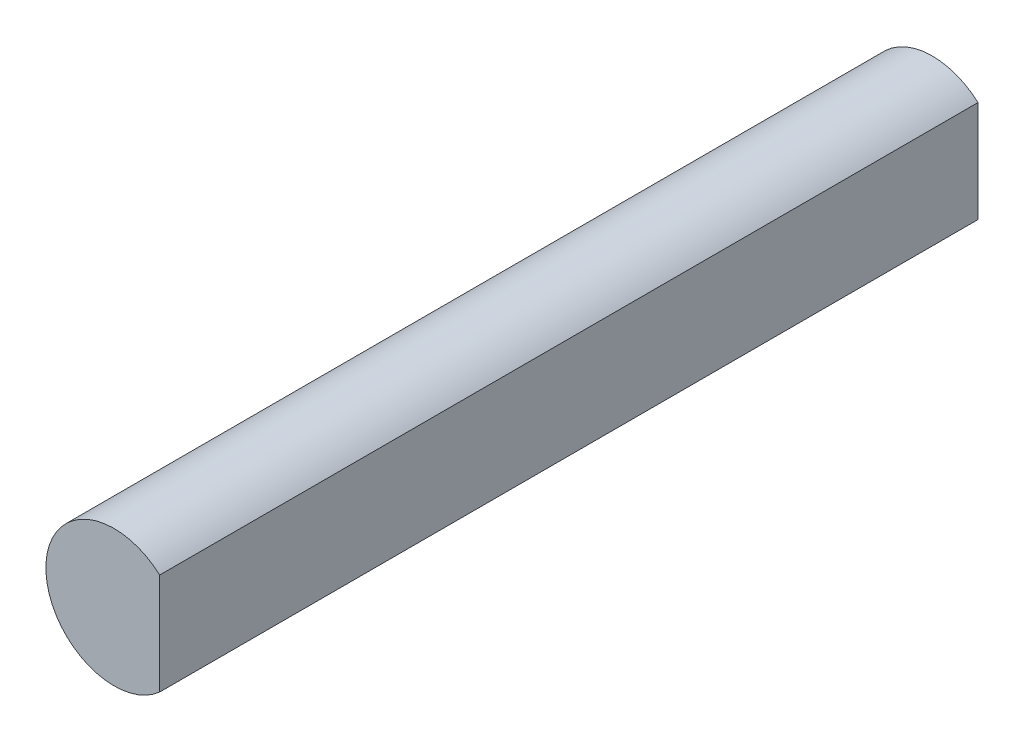
ISO-10303-21;
HEADER;
FILE_DESCRIPTION(('STEP AP214'),'2;1');
FILE_NAME('part.step','',(''),(''),'','','');
FILE_SCHEMA(('AUTOMOTIVE_DESIGN { 1 0 10303 214 1 1 1 1 }'));
ENDSEC;
DATA;
#1=APPLICATION_CONTEXT('core data for automotive mechanical design processes');
#2=APPLICATION_PROTOCOL_DEFINITION('international standard','automotive_design',2000,#1);
#3=PRODUCT_CONTEXT('',#1,'mechanical');
#4=PRODUCT('Part','Part','',(#3));
#5=PRODUCT_RELATED_PRODUCT_CATEGORY('part','',(#4));
#6=PRODUCT_DEFINITION_FORMATION('','',#4);
#7=PRODUCT_DEFINITION_CONTEXT('part definition',#1,'design');
#8=PRODUCT_DEFINITION('design','',#6,#7);
#9=PRODUCT_DEFINITION_SHAPE('','',#8);
#10=(LENGTH_UNIT() NAMED_UNIT(*) SI_UNIT(.MILLI.,.METRE.));
#11=(NAMED_UNIT(*) PLANE_ANGLE_UNIT() SI_UNIT($,.RADIAN.));
#12=(NAMED_UNIT(*) SI_UNIT($,.STERADIAN.) SOLID_ANGLE_UNIT());
#13=UNCERTAINTY_MEASURE_WITH_UNIT(LENGTH_MEASURE(1.E-05),#10,'distance_accuracy_value','');
#14=(GEOMETRIC_REPRESENTATION_CONTEXT(3) GLOBAL_UNCERTAINTY_ASSIGNED_CONTEXT((#13)) GLOBAL_UNIT_ASSIGNED_CONTEXT((#10,
#11,#12)) REPRESENTATION_CONTEXT('',''));
#15=CARTESIAN_POINT('',(0.,0.,0.));
#16=DIRECTION('',(0.,0.,1.));
#17=DIRECTION('',(1.,0.,0.));
#18=AXIS2_PLACEMENT_3D('',#15,#16,#17);
#19=CARTESIAN_POINT('',(0.,0.,30.));
#20=DIRECTION('',(0.,0.,-1.));
#21=DIRECTION('',(-1.,0.,0.));
#22=AXIS2_PLACEMENT_3D('',#19,#20,#21);
#23=CYLINDRICAL_SURFACE('',#22,2.5);
#24=CARTESIAN_POINT('',(0.,0.,30.));
#25=DIRECTION('',(0.,0.,1.));
#26=DIRECTION('',(1.,0.,0.));
#27=AXIS2_PLACEMENT_3D('',#24,#25,#26);
#28=CIRCLE('',#27,2.5);
#29=CARTESIAN_POINT('',(1.67291040295499,1.85778652801795,30.));
#30=VERTEX_POINT('',#29);
#31=CARTESIAN_POINT('',(1.67291040295499,-1.85778652801795,30.));
#32=VERTEX_POINT('',#31);
#33=EDGE_CURVE('E11',#30,#32,#28,.T.);
#34=ORIENTED_EDGE('',*,*,#33,.F.);
#35=DIRECTION('',(0.,0.,-1.));
#36=VECTOR('',#35,1.);
#37=CARTESIAN_POINT('',(1.67291040295499,1.85778652801795,30.));
#38=LINE('',#37,#36);
#39=CARTESIAN_POINT('',(1.67291040295499,1.85778652801795,0.));
#40=VERTEX_POINT('',#39);
#41=EDGE_CURVE('E66',#30,#40,#38,.T.);
#42=ORIENTED_EDGE('',*,*,#41,.T.);
#43=CARTESIAN_POINT('',(0.,0.,0.));
#44=DIRECTION('',(0.,0.,1.));
#45=DIRECTION('',(1.,0.,0.));
#46=AXIS2_PLACEMENT_3D('',#43,#44,#45);
#47=CIRCLE('',#46,2.5);
#48=CARTESIAN_POINT('',(1.67291040295499,-1.85778652801795,0.));
#49=VERTEX_POINT('',#48);
#50=EDGE_CURVE('E48',#40,#49,#47,.T.);
#51=ORIENTED_EDGE('',*,*,#50,.T.);
#52=DIRECTION('',(0.,0.,-1.));
#53=VECTOR('',#52,1.);
#54=CARTESIAN_POINT('',(1.67291040295499,-1.85778652801795,30.));
#55=LINE('',#54,#53);
#56=EDGE_CURVE('E60',#32,#49,#55,.T.);
#57=ORIENTED_EDGE('',*,*,#56,.F.);
#58=EDGE_LOOP('',(#34,#42,#51,#57));
#59=FACE_BOUND('',#58,.T.);
#60=ADVANCED_FACE('F45',(#59),#23,.T.);
#61=CARTESIAN_POINT('',(0.,0.,30.));
#62=DIRECTION('',(0.,0.,1.));
#63=DIRECTION('',(1.,0.,0.));
#64=AXIS2_PLACEMENT_3D('',#61,#62,#63);
#65=PLANE('',#64);
#66=DIRECTION('',(0.,1.,0.));
#67=VECTOR('',#66,1.);
#68=CARTESIAN_POINT('',(1.67291040295499,1.85778652801795,30.));
#69=LINE('',#68,#67);
#70=EDGE_CURVE('E76',#32,#30,#69,.T.);
#71=ORIENTED_EDGE('',*,*,#70,.T.);
#72=ORIENTED_EDGE('',*,*,#33,.T.);
#73=EDGE_LOOP('',(#71,#72));
#74=FACE_BOUND('',#73,.T.);
#75=ADVANCED_FACE('F89',(#74),#65,.T.);
#76=CARTESIAN_POINT('',(0.,0.,0.));
#77=DIRECTION('',(0.,0.,1.));
#78=DIRECTION('',(1.,0.,0.));
#79=AXIS2_PLACEMENT_3D('',#76,#77,#78);
#80=PLANE('',#79);
#81=ORIENTED_EDGE('',*,*,#50,.F.);
#82=DIRECTION('',(0.,1.,0.));
#83=VECTOR('',#82,1.);
#84=CARTESIAN_POINT('',(1.67291040295499,1.85778652801795,0.));
#85=LINE('',#84,#83);
#86=EDGE_CURVE('E70',#49,#40,#85,.T.);
#87=ORIENTED_EDGE('',*,*,#86,.F.);
#88=EDGE_LOOP('',(#81,#87));
#89=FACE_BOUND('',#88,.T.);
#90=ADVANCED_FACE('F82',(#89),#80,.F.);
#91=CARTESIAN_POINT('',(1.67291040295499,1.85778652801795,30.));
#92=DIRECTION('',(-1.,0.,0.));
#93=DIRECTION('',(0.,0.,1.));
#94=AXIS2_PLACEMENT_3D('',#91,#92,#93);
#95=PLANE('',#94);
#96=ORIENTED_EDGE('',*,*,#86,.T.);
#97=ORIENTED_EDGE('',*,*,#41,.F.);
#98=ORIENTED_EDGE('',*,*,#70,.F.);
#99=ORIENTED_EDGE('',*,*,#56,.T.);
#100=EDGE_LOOP('',(#96,#97,#98,#99));
#101=FACE_BOUND('',#100,.T.);
#102=ADVANCED_FACE('F71',(#101),#95,.F.);
#103=CLOSED_SHELL('',(#60,#75,#90,#102));
#104=MANIFOLD_SOLID_BREP('B2',#103);
#105=ADVANCED_BREP_SHAPE_REPRESENTATION('',(#18,#104),#14);
#106=SHAPE_DEFINITION_REPRESENTATION(#9,#105);
ENDSEC;
END-ISO-10303-21;
